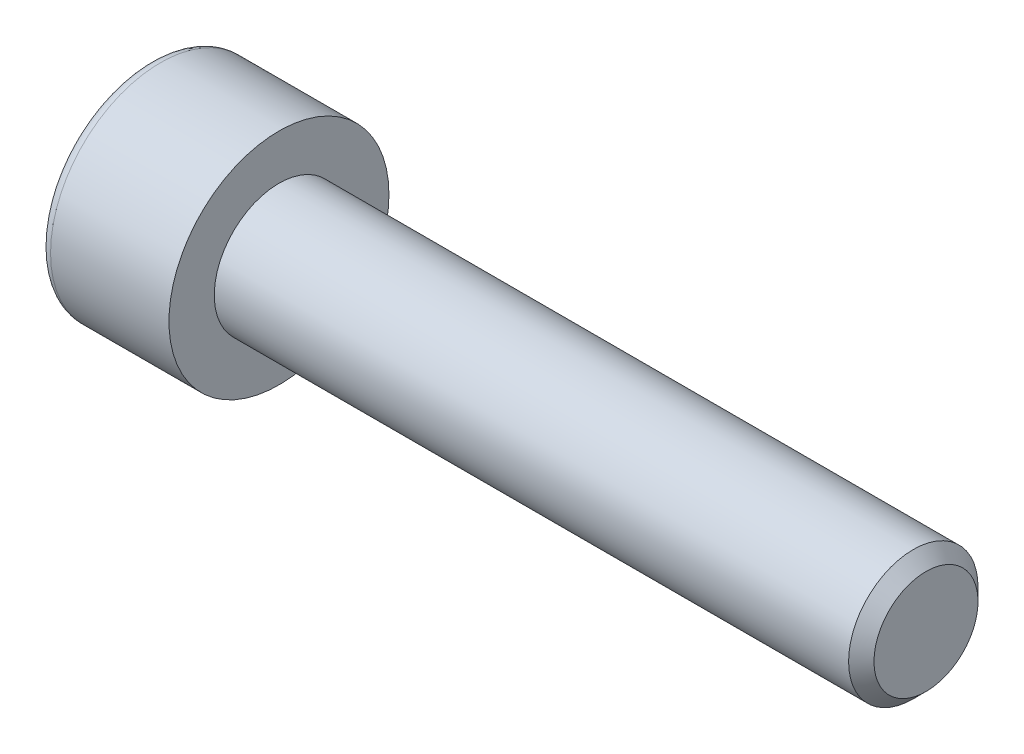
ISO-10303-21;
HEADER;
FILE_DESCRIPTION(('STEP AP214'),'2;1');
FILE_NAME('part.step','',(''),(''),'','','');
FILE_SCHEMA(('AUTOMOTIVE_DESIGN { 1 0 10303 214 1 1 1 1 }'));
ENDSEC;
DATA;
#1=APPLICATION_CONTEXT('core data for automotive mechanical design processes');
#2=APPLICATION_PROTOCOL_DEFINITION('international standard','automotive_design',2000,#1);
#3=PRODUCT_CONTEXT('',#1,'mechanical');
#4=PRODUCT('Part','Part','',(#3));
#5=PRODUCT_RELATED_PRODUCT_CATEGORY('part','',(#4));
#6=PRODUCT_DEFINITION_FORMATION('','',#4);
#7=PRODUCT_DEFINITION_CONTEXT('part definition',#1,'design');
#8=PRODUCT_DEFINITION('design','',#6,#7);
#9=PRODUCT_DEFINITION_SHAPE('','',#8);
#10=(LENGTH_UNIT() NAMED_UNIT(*) SI_UNIT(.MILLI.,.METRE.));
#11=(NAMED_UNIT(*) PLANE_ANGLE_UNIT() SI_UNIT($,.RADIAN.));
#12=(NAMED_UNIT(*) SI_UNIT($,.STERADIAN.) SOLID_ANGLE_UNIT());
#13=UNCERTAINTY_MEASURE_WITH_UNIT(LENGTH_MEASURE(1.E-05),#10,'distance_accuracy_value','');
#14=(GEOMETRIC_REPRESENTATION_CONTEXT(3) GLOBAL_UNCERTAINTY_ASSIGNED_CONTEXT((#13)) GLOBAL_UNIT_ASSIGNED_CONTEXT((#10,
#11,#12)) REPRESENTATION_CONTEXT('',''));
#15=CARTESIAN_POINT('',(0.,0.,0.));
#16=DIRECTION('',(0.,0.,1.));
#17=DIRECTION('',(1.,0.,0.));
#18=AXIS2_PLACEMENT_3D('',#15,#16,#17);
#19=CARTESIAN_POINT('',(25.,-2.04969,2.0095));
#20=DIRECTION('',(1.,0.,0.));
#21=DIRECTION('',(0.,0.,-1.));
#22=AXIS2_PLACEMENT_3D('',#19,#20,#21);
#23=PLANE('',#22);
#24=CARTESIAN_POINT('',(25.,0.,0.));
#25=DIRECTION('',(-1.,0.,0.));
#26=DIRECTION('',(0.,0.,1.));
#27=AXIS2_PLACEMENT_3D('',#24,#25,#26);
#28=CIRCLE('',#27,2.0095);
#29=CARTESIAN_POINT('',(25.,0.,2.0095));
#30=VERTEX_POINT('',#29);
#31=EDGE_CURVE('E20',#30,#30,#28,.T.);
#32=ORIENTED_EDGE('',*,*,#31,.F.);
#33=EDGE_LOOP('',(#32));
#34=FACE_BOUND('',#33,.T.);
#35=ADVANCED_FACE('F16',(#34),#23,.T.);
#36=CARTESIAN_POINT('',(25.,0.,0.));
#37=DIRECTION('',(-1.,0.,0.));
#38=DIRECTION('',(0.,0.,1.));
#39=AXIS2_PLACEMENT_3D('',#36,#37,#38);
#40=CONICAL_SURFACE('',#39,2.0095,0.785398163397448);
#41=ORIENTED_EDGE('',*,*,#31,.T.);
#42=EDGE_LOOP('',(#41));
#43=FACE_BOUND('',#42,.T.);
#44=CARTESIAN_POINT('',(24.5095,0.,0.));
#45=DIRECTION('',(-1.,0.,0.));
#46=DIRECTION('',(0.,0.,1.));
#47=AXIS2_PLACEMENT_3D('',#44,#45,#46);
#48=CIRCLE('',#47,2.5);
#49=CARTESIAN_POINT('',(24.5095,0.,2.5));
#50=VERTEX_POINT('',#49);
#51=EDGE_CURVE('E113',#50,#50,#48,.T.);
#52=ORIENTED_EDGE('',*,*,#51,.F.);
#53=EDGE_LOOP('',(#52));
#54=FACE_BOUND('',#53,.T.);
#55=ADVANCED_FACE('F209',(#43,#54),#40,.T.);
#56=CARTESIAN_POINT('',(0.,0.,0.));
#57=DIRECTION('',(1.,0.,0.));
#58=DIRECTION('',(0.,0.,-1.));
#59=AXIS2_PLACEMENT_3D('',#56,#57,#58);
#60=CYLINDRICAL_SURFACE('',#59,2.5);
#61=CARTESIAN_POINT('',(0.,0.,0.));
#62=DIRECTION('',(1.,0.,0.));
#63=DIRECTION('',(0.,0.,-1.));
#64=AXIS2_PLACEMENT_3D('',#61,#62,#63);
#65=CIRCLE('',#64,2.5);
#66=CARTESIAN_POINT('',(0.,0.,-2.5));
#67=VERTEX_POINT('',#66);
#68=EDGE_CURVE('E92',#67,#67,#65,.F.);
#69=ORIENTED_EDGE('',*,*,#68,.F.);
#70=EDGE_LOOP('',(#69));
#71=FACE_BOUND('',#70,.T.);
#72=ORIENTED_EDGE('',*,*,#51,.T.);
#73=EDGE_LOOP('',(#72));
#74=FACE_BOUND('',#73,.T.);
#75=ADVANCED_FACE('F206',(#71,#74),#60,.T.);
#76=CARTESIAN_POINT('',(-1.9,0.,0.));
#77=DIRECTION('',(-1.,0.,0.));
#78=DIRECTION('',(0.,0.,1.));
#79=AXIS2_PLACEMENT_3D('',#76,#77,#78);
#80=CONICAL_SURFACE('',#79,2.3094010767585,1.0471975511966);
#81=CARTESIAN_POINT('',(-1.9,0.,2.3094010767585));
#82=CARTESIAN_POINT('',(-1.87069554512665,-0.0878878875630438,2.25865898121547));
#83=CARTESIAN_POINT('',(-1.84404467710022,-0.176534422121215,2.20747888062559));
#84=CARTESIAN_POINT('',(-1.79752638740027,-0.355362346686105,2.10423253023943));
#85=CARTESIAN_POINT('',(-1.77767542033809,-0.44554691308464,2.05216444655249));
#86=CARTESIAN_POINT('',(-1.74677595894609,-0.624798433758891,1.94867353283856));
#87=CARTESIAN_POINT('',(-1.73552178759691,-0.713837815616439,1.89726662175463));
#88=CARTESIAN_POINT('',(-1.72208916813045,-0.892335320462004,1.79421103928237));
#89=CARTESIAN_POINT('',(-1.7198995939742,-0.981792795105295,1.74256274221605));
#90=CARTESIAN_POINT('',(-1.72446629015479,-1.14893448970974,1.64606343984337));
#91=CARTESIAN_POINT('',(-1.73010128521626,-1.22664379064383,1.60119795403054));
#92=CARTESIAN_POINT('',(-1.74795730071816,-1.38155614176471,1.5117592664101));
#93=CARTESIAN_POINT('',(-1.76018441476867,-1.45875865655097,1.46718637371614));
#94=CARTESIAN_POINT('',(-1.79074983333835,-1.61399014172453,1.37756343396448));
#95=CARTESIAN_POINT('',(-1.80921764221832,-1.69199947538354,1.33252472417715));
#96=CARTESIAN_POINT('',(-1.85113176083937,-1.84685497000488,1.24311886267203));
#97=CARTESIAN_POINT('',(-1.87456822875222,-1.92370311331472,1.19875056644538));
#98=CARTESIAN_POINT('',(-1.90000000000001,-1.99999999999999,1.15470053837931));
#99=B_SPLINE_CURVE_WITH_KNOTS('',3,(#81,#82,#83,#84,#85,#86,#87,#88,#89,#90,#91,#92,#93,#94,#95,
#96,#97,#98),.UNSPECIFIED.,.F.,.F.,(4,2,2,2,2,2,2,2,4),(0.,0.317016011556855,0.634793817027109,
0.944707606152922,1.25424088889782,1.52370778263188,1.79342419379439,2.06912162248864,
2.34427797351492),.UNSPECIFIED.);
#100=CARTESIAN_POINT('',(-1.9,0.,2.3094010767585));
#101=VERTEX_POINT('',#100);
#102=CARTESIAN_POINT('',(-1.90000000000001,-2.,1.1547005383793));
#103=VERTEX_POINT('',#102);
#104=EDGE_CURVE('E82',#101,#103,#99,.T.);
#105=ORIENTED_EDGE('',*,*,#104,.F.);
#106=CARTESIAN_POINT('',(-1.90000000000002,2.,1.1547005383793));
#107=CARTESIAN_POINT('',(-1.87069554512667,1.91211211243696,1.20544263392233));
#108=CARTESIAN_POINT('',(-1.84404467710023,1.82346557787879,1.25662273451221));
#109=CARTESIAN_POINT('',(-1.79752638740028,1.6446376533139,1.35986908489837));
#110=CARTESIAN_POINT('',(-1.7776754203381,1.55445308691536,1.41193716858531));
#111=CARTESIAN_POINT('',(-1.74677595894609,1.37520156624111,1.51542808229924));
#112=CARTESIAN_POINT('',(-1.73552178759691,1.28616218438356,1.56683499338317));
#113=CARTESIAN_POINT('',(-1.72208916813045,1.10766467953799,1.66989057585543));
#114=CARTESIAN_POINT('',(-1.7198995939742,1.0182072048947,1.72153887292176));
#115=CARTESIAN_POINT('',(-1.72446629015479,0.851065510290257,1.81803817529444));
#116=CARTESIAN_POINT('',(-1.73010128521625,0.773356209356166,1.86290366110727));
#117=CARTESIAN_POINT('',(-1.74795730071815,0.618443858235278,1.95234234872771));
#118=CARTESIAN_POINT('',(-1.76018441476867,0.541241343449025,1.99691524142166));
#119=CARTESIAN_POINT('',(-1.79074983333834,0.386009858275461,2.08653818117332));
#120=CARTESIAN_POINT('',(-1.80921764221831,0.308000524616451,2.13157689096065));
#121=CARTESIAN_POINT('',(-1.85113176083936,0.153145029995107,2.22098275246578));
#122=CARTESIAN_POINT('',(-1.87456822875221,0.0762968866852722,2.26535104869243));
#123=CARTESIAN_POINT('',(-1.9,0.,2.3094010767585));
#124=B_SPLINE_CURVE_WITH_KNOTS('',3,(#106,#107,#108,#109,#110,#111,#112,#113,#114,#115,#116,
#117,#118,#119,#120,#121,#122,#123),.UNSPECIFIED.,.F.,.F.,(4,2,2,2,2,2,2,2,4),(0.,
0.317016011556859,0.634793817027117,0.944707606152934,1.25424088889784,1.5237077826319,
1.7934241937944,2.06912162248865,2.34427797351493),.UNSPECIFIED.);
#125=CARTESIAN_POINT('',(-1.90000000000001,2.,1.15470053837929));
#126=VERTEX_POINT('',#125);
#127=EDGE_CURVE('E79',#126,#101,#124,.T.);
#128=ORIENTED_EDGE('',*,*,#127,.F.);
#129=CARTESIAN_POINT('',(-1.9,2.,-1.15470053837923));
#130=CARTESIAN_POINT('',(-1.87069554512665,2.,-1.05321634729317));
#131=CARTESIAN_POINT('',(-1.84404467710021,2.,-0.950856146113392));
#132=CARTESIAN_POINT('',(-1.79752638740026,2.,-0.744363445341073));
#133=CARTESIAN_POINT('',(-1.77767542033809,2.,-0.640227277967187));
#134=CARTESIAN_POINT('',(-1.74677595894608,2.,-0.433245450539333));
#135=CARTESIAN_POINT('',(-1.7355217875969,2.,-0.330431628371469));
#136=CARTESIAN_POINT('',(-1.72208916813044,2.,-0.124320463426946));
#137=CARTESIAN_POINT('',(-1.71989959397419,2.,-0.0210238692942912));
#138=CARTESIAN_POINT('',(-1.72446629015478,2.,0.171974735451078));
#139=CARTESIAN_POINT('',(-1.73010128521625,2.,0.261705707076751));
#140=CARTESIAN_POINT('',(-1.74795730071815,2.,0.44058308231764));
#141=CARTESIAN_POINT('',(-1.76018441476866,2.,0.529728867705562));
#142=CARTESIAN_POINT('',(-1.79074983333834,2.,0.708974747208891));
#143=CARTESIAN_POINT('',(-1.80921764221831,2.,0.799052166783559));
#144=CARTESIAN_POINT('',(-1.85113176083936,2.,0.977863889793815));
#145=CARTESIAN_POINT('',(-1.87456822875222,2.,1.06660048224713));
#146=CARTESIAN_POINT('',(-1.90000000000001,2.,1.15470053837928));
#147=B_SPLINE_CURVE_WITH_KNOTS('',3,(#129,#130,#131,#132,#133,#134,#135,#136,#137,#138,#139,
#140,#141,#142,#143,#144,#145,#146),.UNSPECIFIED.,.F.,.F.,(4,2,2,2,2,2,2,2,4),(0.,
0.317016011556853,0.634793817027106,0.944707606152917,1.25424088889781,1.52370778263189,
1.7934241937944,2.06912162248866,2.34427797351496),.UNSPECIFIED.);
#148=CARTESIAN_POINT('',(-1.89999999999999,2.,-1.15470053837921));
#149=VERTEX_POINT('',#148);
#150=EDGE_CURVE('E67',#149,#126,#147,.T.);
#151=ORIENTED_EDGE('',*,*,#150,.F.);
#152=CARTESIAN_POINT('',(-1.9,0.,-2.3094010767585));
#153=CARTESIAN_POINT('',(-1.87069554512665,0.0878878875630413,-2.25865898121547));
#154=CARTESIAN_POINT('',(-1.84404467710021,0.17653442212121,-2.20747888062558));
#155=CARTESIAN_POINT('',(-1.79752638740026,0.355362346686095,-2.10423253023942));
#156=CARTESIAN_POINT('',(-1.77767542033808,0.445546913084628,-2.05216444655247));
#157=CARTESIAN_POINT('',(-1.74677595894607,0.624798433758874,-1.94867353283854));
#158=CARTESIAN_POINT('',(-1.73552178759689,0.71383781561642,-1.89726662175461));
#159=CARTESIAN_POINT('',(-1.72208916813043,0.89233532046198,-1.79421103928234));
#160=CARTESIAN_POINT('',(-1.71989959397418,0.981792795105269,-1.74256274221601));
#161=CARTESIAN_POINT('',(-1.72446629015476,1.14893448970971,-1.64606343984333));
#162=CARTESIAN_POINT('',(-1.73010128521623,1.2266437906438,-1.60119795403049));
#163=CARTESIAN_POINT('',(-1.74795730071813,1.3815561417647,-1.51175926641004));
#164=CARTESIAN_POINT('',(-1.76018441476864,1.45875865655095,-1.46718637371607));
#165=CARTESIAN_POINT('',(-1.79074983333831,1.61399014172452,-1.37756343396441));
#166=CARTESIAN_POINT('',(-1.80921764221829,1.69199947538354,-1.33252472417707));
#167=CARTESIAN_POINT('',(-1.85113176083934,1.84685497000489,-1.24311886267194));
#168=CARTESIAN_POINT('',(-1.87456822875219,1.92370311331472,-1.19875056644528));
#169=CARTESIAN_POINT('',(-1.89999999999999,2.,-1.1547005383792));
#170=B_SPLINE_CURVE_WITH_KNOTS('',3,(#152,#153,#154,#155,#156,#157,#158,#159,#160,#161,#162,
#163,#164,#165,#166,#167,#168,#169),.UNSPECIFIED.,.F.,.F.,(4,2,2,2,2,2,2,2,4),(0.,
0.317016011556855,0.634793817027109,0.944707606152921,1.25424088889782,1.5237077826319,
1.79342419379442,2.06912162248868,2.34427797351498),.UNSPECIFIED.);
#171=CARTESIAN_POINT('',(-1.9,0.,-2.3094010767585));
#172=VERTEX_POINT('',#171);
#173=EDGE_CURVE('E125',#172,#149,#170,.T.);
#174=ORIENTED_EDGE('',*,*,#173,.F.);
#175=CARTESIAN_POINT('',(-1.90000000000001,-1.99999999999999,-1.1547005383793));
#176=CARTESIAN_POINT('',(-1.87069554512666,-1.91211211243695,-1.20544263392233));
#177=CARTESIAN_POINT('',(-1.84404467710023,-1.82346557787878,-1.25662273451222));
#178=CARTESIAN_POINT('',(-1.79752638740027,-1.64463765331388,-1.35986908489838));
#179=CARTESIAN_POINT('',(-1.7776754203381,-1.55445308691535,-1.41193716858532));
#180=CARTESIAN_POINT('',(-1.74677595894609,-1.3752015662411,-1.51542808229924));
#181=CARTESIAN_POINT('',(-1.73552178759691,-1.28616218438355,-1.56683499338317));
#182=CARTESIAN_POINT('',(-1.72208916813045,-1.10766467953798,-1.66989057585543));
#183=CARTESIAN_POINT('',(-1.7198995939742,-1.01820720489469,-1.72153887292176));
#184=CARTESIAN_POINT('',(-1.72446629015479,-0.851065510290249,-1.81803817529444));
#185=CARTESIAN_POINT('',(-1.73010128521626,-0.773356209356158,-1.86290366110727));
#186=CARTESIAN_POINT('',(-1.74795730071816,-0.618443858235273,-1.95234234872771));
#187=CARTESIAN_POINT('',(-1.76018441476867,-0.541241343449019,-1.99691524142167));
#188=CARTESIAN_POINT('',(-1.79074983333834,-0.386009858275457,-2.08653818117332));
#189=CARTESIAN_POINT('',(-1.80921764221831,-0.308000524616448,-2.13157689096065));
#190=CARTESIAN_POINT('',(-1.85113176083936,-0.153145029995106,-2.22098275246578));
#191=CARTESIAN_POINT('',(-1.87456822875221,-0.0762968866852709,-2.26535104869243));
#192=CARTESIAN_POINT('',(-1.9,0.,-2.3094010767585));
#193=B_SPLINE_CURVE_WITH_KNOTS('',3,(#175,#176,#177,#178,#179,#180,#181,#182,#183,#184,#185,
#186,#187,#188,#189,#190,#191,#192),.UNSPECIFIED.,.F.,.F.,(4,2,2,2,2,2,2,2,4),(0.,
0.317016011556858,0.634793817027115,0.944707606152931,1.25424088889783,1.52370778263189,
1.79342419379439,2.06912162248864,2.34427797351492),.UNSPECIFIED.);
#194=CARTESIAN_POINT('',(-1.90000000000001,-2.,-1.1547005383793));
#195=VERTEX_POINT('',#194);
#196=EDGE_CURVE('E133',#195,#172,#193,.T.);
#197=ORIENTED_EDGE('',*,*,#196,.F.);
#198=CARTESIAN_POINT('',(-1.90000000000001,-2.,1.15470053837929));
#199=CARTESIAN_POINT('',(-1.87069554512666,-2.,1.05321634729323));
#200=CARTESIAN_POINT('',(-1.84404467710023,-2.,0.950856146113455));
#201=CARTESIAN_POINT('',(-1.79752638740027,-2.,0.744363445341134));
#202=CARTESIAN_POINT('',(-1.7776754203381,-2.,0.640227277967246));
#203=CARTESIAN_POINT('',(-1.74677595894609,-2.,0.43324545053939));
#204=CARTESIAN_POINT('',(-1.73552178759691,-2.,0.330431628371524));
#205=CARTESIAN_POINT('',(-1.72208916813044,-2.,0.124320463426999));
#206=CARTESIAN_POINT('',(-1.71989959397419,-2.,0.0210238692943427));
#207=CARTESIAN_POINT('',(-1.72446629015478,-2.,-0.171974735451032));
#208=CARTESIAN_POINT('',(-1.73010128521624,-2.,-0.261705707076711));
#209=CARTESIAN_POINT('',(-1.74795730071814,-2.,-0.440583082317611));
#210=CARTESIAN_POINT('',(-1.76018441476866,-2.,-0.529728867705538));
#211=CARTESIAN_POINT('',(-1.79074983333833,-2.,-0.708974747208878));
#212=CARTESIAN_POINT('',(-1.80921764221831,-2.,-0.799052166783552));
#213=CARTESIAN_POINT('',(-1.85113176083936,-2.,-0.977863889793819));
#214=CARTESIAN_POINT('',(-1.87456822875222,-2.,-1.06660048224714));
#215=CARTESIAN_POINT('',(-1.90000000000001,-2.,-1.15470053837929));
#216=B_SPLINE_CURVE_WITH_KNOTS('',3,(#198,#199,#200,#201,#202,#203,#204,#205,#206,#207,#208,
#209,#210,#211,#212,#213,#214,#215),.UNSPECIFIED.,.F.,.F.,(4,2,2,2,2,2,2,2,4),(0.,
0.317016011556858,0.634793817027115,0.944707606152931,1.25424088889783,1.52370778263192,
1.79342419379445,2.06912162248873,2.34427797351504),.UNSPECIFIED.);
#217=EDGE_CURVE('E175',#103,#195,#216,.T.);
#218=ORIENTED_EDGE('',*,*,#217,.F.);
#219=EDGE_LOOP('',(#105,#128,#151,#174,#197,#218));
#220=FACE_BOUND('',#219,.T.);
#221=CARTESIAN_POINT('',(-0.56666666666667,0.,0.));
#222=VERTEX_POINT('',#221);
#223=VERTEX_LOOP('',#222);
#224=FACE_BOUND('',#223,.T.);
#225=ADVANCED_FACE('F80',(#220,#224),#80,.F.);
#226=CARTESIAN_POINT('',(0.,-4.335,4.25));
#227=DIRECTION('',(1.,0.,0.));
#228=DIRECTION('',(0.,0.,-1.));
#229=AXIS2_PLACEMENT_3D('',#226,#227,#228);
#230=PLANE('',#229);
#231=CARTESIAN_POINT('',(0.,0.,0.));
#232=DIRECTION('',(1.,0.,0.));
#233=DIRECTION('',(0.,0.,-1.));
#234=AXIS2_PLACEMENT_3D('',#231,#232,#233);
#235=CIRCLE('',#234,4.25);
#236=CARTESIAN_POINT('',(0.,0.,-4.25));
#237=VERTEX_POINT('',#236);
#238=EDGE_CURVE('E107',#237,#237,#235,.F.);
#239=ORIENTED_EDGE('',*,*,#238,.F.);
#240=EDGE_LOOP('',(#239));
#241=FACE_BOUND('',#240,.T.);
#242=ORIENTED_EDGE('',*,*,#68,.T.);
#243=EDGE_LOOP('',(#242));
#244=FACE_BOUND('',#243,.T.);
#245=ADVANCED_FACE('F204',(#241,#244),#230,.T.);
#246=CARTESIAN_POINT('',(-5.,2.,-1.1547005383793));
#247=DIRECTION('',(0.,-1.,0.));
#248=DIRECTION('',(1.,0.,0.));
#249=AXIS2_PLACEMENT_3D('',#246,#247,#248);
#250=PLANE('',#249);
#251=DIRECTION('',(0.,0.,1.));
#252=VECTOR('',#251,1.);
#253=CARTESIAN_POINT('',(-4.99999999995,2.,0.));
#254=LINE('',#253,#252);
#255=CARTESIAN_POINT('',(-4.99999999995,2.,-1.15470053837925));
#256=VERTEX_POINT('',#255);
#257=CARTESIAN_POINT('',(-4.99999999995,2.,1.1547005383793));
#258=VERTEX_POINT('',#257);
#259=EDGE_CURVE('E72',#256,#258,#254,.T.);
#260=ORIENTED_EDGE('',*,*,#259,.F.);
#261=DIRECTION('',(-1.,0.,0.));
#262=VECTOR('',#261,1.);
#263=CARTESIAN_POINT('',(-3.28333333333335,2.,-1.1547005383792));
#264=LINE('',#263,#262);
#265=EDGE_CURVE('E90',#149,#256,#264,.T.);
#266=ORIENTED_EDGE('',*,*,#265,.F.);
#267=ORIENTED_EDGE('',*,*,#150,.T.);
#268=DIRECTION('',(1.,0.,0.));
#269=VECTOR('',#268,1.);
#270=CARTESIAN_POINT('',(-3.28333333333335,2.,1.1547005383793));
#271=LINE('',#270,#269);
#272=EDGE_CURVE('E86',#258,#126,#271,.T.);
#273=ORIENTED_EDGE('',*,*,#272,.F.);
#274=EDGE_LOOP('',(#260,#266,#267,#273));
#275=FACE_BOUND('',#274,.T.);
#276=ADVANCED_FACE('F88',(#275),#250,.T.);
#277=CARTESIAN_POINT('',(-5.,2.,1.1547005383793));
#278=DIRECTION('',(0.,-0.499999999999983,-0.866025403784448));
#279=DIRECTION('',(1.,0.,0.));
#280=AXIS2_PLACEMENT_3D('',#277,#278,#279);
#281=PLANE('',#280);
#282=DIRECTION('',(0.,-0.866025403784448,0.499999999999983));
#283=VECTOR('',#282,1.);
#284=CARTESIAN_POINT('',(-4.99999999995,2.,1.1547005383793));
#285=LINE('',#284,#283);
#286=CARTESIAN_POINT('',(-4.99999999995,0.,2.3094010767585));
#287=VERTEX_POINT('',#286);
#288=EDGE_CURVE('E96',#258,#287,#285,.T.);
#289=ORIENTED_EDGE('',*,*,#288,.F.);
#290=ORIENTED_EDGE('',*,*,#272,.T.);
#291=ORIENTED_EDGE('',*,*,#127,.T.);
#292=DIRECTION('',(1.,0.,0.));
#293=VECTOR('',#292,1.);
#294=CARTESIAN_POINT('',(-3.28333333333335,0.,2.3094010767585));
#295=LINE('',#294,#293);
#296=EDGE_CURVE('E98',#287,#101,#295,.T.);
#297=ORIENTED_EDGE('',*,*,#296,.F.);
#298=EDGE_LOOP('',(#289,#290,#291,#297));
#299=FACE_BOUND('',#298,.T.);
#300=ADVANCED_FACE('F94',(#299),#281,.T.);
#301=CARTESIAN_POINT('',(-5.,0.,2.3094010767585));
#302=DIRECTION('',(0.,0.499999999999983,-0.866025403784448));
#303=DIRECTION('',(1.,0.,0.));
#304=AXIS2_PLACEMENT_3D('',#301,#302,#303);
#305=PLANE('',#304);
#306=DIRECTION('',(0.,-0.866025403784448,-0.499999999999983));
#307=VECTOR('',#306,1.);
#308=CARTESIAN_POINT('',(-4.99999999995,0.,2.3094010767585));
#309=LINE('',#308,#307);
#310=CARTESIAN_POINT('',(-4.99999999995,-2.,1.1547005383793));
#311=VERTEX_POINT('',#310);
#312=EDGE_CURVE('E112',#287,#311,#309,.T.);
#313=ORIENTED_EDGE('',*,*,#312,.F.);
#314=ORIENTED_EDGE('',*,*,#296,.T.);
#315=ORIENTED_EDGE('',*,*,#104,.T.);
#316=DIRECTION('',(1.,0.,0.));
#317=VECTOR('',#316,1.);
#318=CARTESIAN_POINT('',(-3.28333333333335,-2.,1.1547005383793));
#319=LINE('',#318,#317);
#320=EDGE_CURVE('E171',#311,#103,#319,.T.);
#321=ORIENTED_EDGE('',*,*,#320,.F.);
#322=EDGE_LOOP('',(#313,#314,#315,#321));
#323=FACE_BOUND('',#322,.T.);
#324=ADVANCED_FACE('F186',(#323),#305,.T.);
#325=CARTESIAN_POINT('',(-5.,-2.,1.1547005383793));
#326=DIRECTION('',(0.,1.,0.));
#327=DIRECTION('',(1.,0.,0.));
#328=AXIS2_PLACEMENT_3D('',#325,#326,#327);
#329=PLANE('',#328);
#330=DIRECTION('',(0.,0.,-1.));
#331=VECTOR('',#330,1.);
#332=CARTESIAN_POINT('',(-4.99999999995,-2.,0.));
#333=LINE('',#332,#331);
#334=CARTESIAN_POINT('',(-4.99999999995,-2.,-1.1547005383793));
#335=VERTEX_POINT('',#334);
#336=EDGE_CURVE('E108',#311,#335,#333,.T.);
#337=ORIENTED_EDGE('',*,*,#336,.F.);
#338=ORIENTED_EDGE('',*,*,#320,.T.);
#339=ORIENTED_EDGE('',*,*,#217,.T.);
#340=DIRECTION('',(1.,0.,0.));
#341=VECTOR('',#340,1.);
#342=CARTESIAN_POINT('',(-3.28333333333335,-2.,-1.1547005383793));
#343=LINE('',#342,#341);
#344=EDGE_CURVE('E132',#335,#195,#343,.T.);
#345=ORIENTED_EDGE('',*,*,#344,.F.);
#346=EDGE_LOOP('',(#337,#338,#339,#345));
#347=FACE_BOUND('',#346,.T.);
#348=ADVANCED_FACE('F183',(#347),#329,.T.);
#349=CARTESIAN_POINT('',(-5.,-2.,-1.1547005383793));
#350=DIRECTION('',(0.,0.499999999999983,0.866025403784448));
#351=DIRECTION('',(1.,0.,0.));
#352=AXIS2_PLACEMENT_3D('',#349,#350,#351);
#353=PLANE('',#352);
#354=DIRECTION('',(0.,0.866025403784448,-0.499999999999983));
#355=VECTOR('',#354,1.);
#356=CARTESIAN_POINT('',(-4.99999999995,-2.,-1.1547005383793));
#357=LINE('',#356,#355);
#358=CARTESIAN_POINT('',(-4.99999999995,0.,-2.3094010767585));
#359=VERTEX_POINT('',#358);
#360=EDGE_CURVE('E111',#335,#359,#357,.T.);
#361=ORIENTED_EDGE('',*,*,#360,.F.);
#362=ORIENTED_EDGE('',*,*,#344,.T.);
#363=ORIENTED_EDGE('',*,*,#196,.T.);
#364=DIRECTION('',(1.,0.,0.));
#365=VECTOR('',#364,1.);
#366=CARTESIAN_POINT('',(-3.28333333333335,0.,-2.3094010767585));
#367=LINE('',#366,#365);
#368=EDGE_CURVE('E35',#359,#172,#367,.T.);
#369=ORIENTED_EDGE('',*,*,#368,.F.);
#370=EDGE_LOOP('',(#361,#362,#363,#369));
#371=FACE_BOUND('',#370,.T.);
#372=ADVANCED_FACE('F147',(#371),#353,.T.);
#373=CARTESIAN_POINT('',(-5.,0.,-2.3094010767585));
#374=DIRECTION('',(0.,-0.500000000000015,0.86602540378443));
#375=DIRECTION('',(1.,0.,0.));
#376=AXIS2_PLACEMENT_3D('',#373,#374,#375);
#377=PLANE('',#376);
#378=DIRECTION('',(0.,0.866025403784448,0.499999999999983));
#379=VECTOR('',#378,1.);
#380=CARTESIAN_POINT('',(-4.99999999995,0.,-2.3094010767585));
#381=LINE('',#380,#379);
#382=EDGE_CURVE('E105',#359,#256,#381,.T.);
#383=ORIENTED_EDGE('',*,*,#382,.F.);
#384=ORIENTED_EDGE('',*,*,#368,.T.);
#385=ORIENTED_EDGE('',*,*,#173,.T.);
#386=ORIENTED_EDGE('',*,*,#265,.T.);
#387=EDGE_LOOP('',(#383,#384,#385,#386));
#388=FACE_BOUND('',#387,.T.);
#389=ADVANCED_FACE('F142',(#388),#377,.T.);
#390=CARTESIAN_POINT('',(-4.575,0.,0.));
#391=DIRECTION('',(1.,0.,0.));
#392=DIRECTION('',(0.,0.,-1.));
#393=AXIS2_PLACEMENT_3D('',#390,#391,#392);
#394=CYLINDRICAL_SURFACE('',#393,4.25);
#395=ORIENTED_EDGE('',*,*,#238,.T.);
#396=EDGE_LOOP('',(#395));
#397=FACE_BOUND('',#396,.T.);
#398=CARTESIAN_POINT('',(-4.575,0.,0.));
#399=DIRECTION('',(-1.,0.,0.));
#400=DIRECTION('',(0.,0.,1.));
#401=AXIS2_PLACEMENT_3D('',#398,#399,#400);
#402=CIRCLE('',#401,4.2499999999);
#403=CARTESIAN_POINT('',(-4.575,0.,4.2499999999));
#404=VERTEX_POINT('',#403);
#405=EDGE_CURVE('E26',#404,#404,#402,.T.);
#406=ORIENTED_EDGE('',*,*,#405,.F.);
#407=EDGE_LOOP('',(#406));
#408=FACE_BOUND('',#407,.T.);
#409=ADVANCED_FACE('F146',(#397,#408),#394,.T.);
#410=CARTESIAN_POINT('',(-4.99999999995,-3.9015,-3.825));
#411=DIRECTION('',(-1.,0.,0.));
#412=DIRECTION('',(0.,0.,1.));
#413=AXIS2_PLACEMENT_3D('',#410,#411,#412);
#414=PLANE('',#413);
#415=ORIENTED_EDGE('',*,*,#360,.T.);
#416=ORIENTED_EDGE('',*,*,#382,.T.);
#417=ORIENTED_EDGE('',*,*,#259,.T.);
#418=ORIENTED_EDGE('',*,*,#288,.T.);
#419=ORIENTED_EDGE('',*,*,#312,.T.);
#420=ORIENTED_EDGE('',*,*,#336,.T.);
#421=EDGE_LOOP('',(#415,#416,#417,#418,#419,#420));
#422=FACE_BOUND('',#421,.T.);
#423=CARTESIAN_POINT('',(-4.9999999999,0.,0.));
#424=DIRECTION('',(1.,0.,0.));
#425=DIRECTION('',(0.,0.,-1.));
#426=AXIS2_PLACEMENT_3D('',#423,#424,#425);
#427=CIRCLE('',#426,3.82499999995044);
#428=CARTESIAN_POINT('',(-4.9999999999,0.,-3.82499999995044));
#429=VERTEX_POINT('',#428);
#430=EDGE_CURVE('E10',#429,#429,#427,.T.);
#431=ORIENTED_EDGE('',*,*,#430,.F.);
#432=EDGE_LOOP('',(#431));
#433=FACE_BOUND('',#432,.T.);
#434=ADVANCED_FACE('F152',(#422,#433),#414,.T.);
#435=CARTESIAN_POINT('',(-4.5749999999,0.,0.));
#436=DIRECTION('',(1.,0.,0.));
#437=DIRECTION('',(0.,0.,-1.));
#438=AXIS2_PLACEMENT_3D('',#435,#436,#437);
#439=TOROIDAL_SURFACE('',#438,3.8249999999,0.425000000000002);
#440=ORIENTED_EDGE('',*,*,#430,.T.);
#441=EDGE_LOOP('',(#440));
#442=FACE_BOUND('',#441,.T.);
#443=ORIENTED_EDGE('',*,*,#405,.T.);
#444=EDGE_LOOP('',(#443));
#445=FACE_BOUND('',#444,.T.);
#446=ADVANCED_FACE('F18',(#442,#445),#439,.T.);
#447=CLOSED_SHELL('',(#35,#55,#75,#225,#245,#276,#300,#324,#348,#372,#389,#409,#434,#446));
#448=MANIFOLD_SOLID_BREP('B1',#447);
#449=ADVANCED_BREP_SHAPE_REPRESENTATION('',(#18,#448),#14);
#450=SHAPE_DEFINITION_REPRESENTATION(#9,#449);
ENDSEC;
END-ISO-10303-21;
